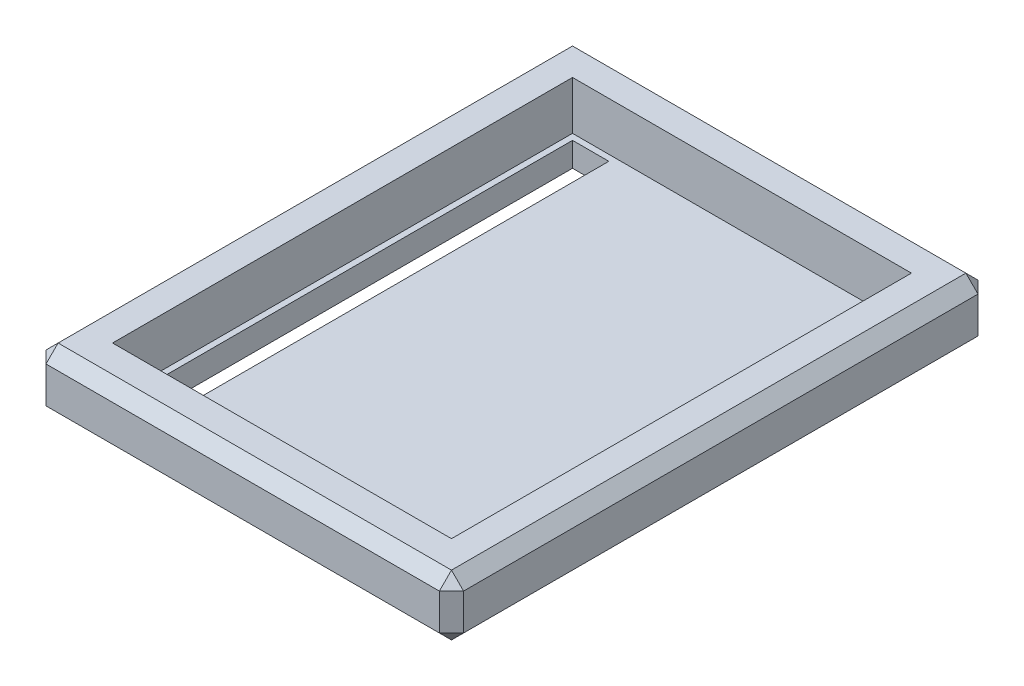
ISO-10303-21;
HEADER;
FILE_DESCRIPTION(('STEP AP214'),'2;1');
FILE_NAME('part.step','',(''),(''),'','','');
FILE_SCHEMA(('AUTOMOTIVE_DESIGN { 1 0 10303 214 1 1 1 1 }'));
ENDSEC;
DATA;
#1=APPLICATION_CONTEXT('core data for automotive mechanical design processes');
#2=APPLICATION_PROTOCOL_DEFINITION('international standard','automotive_design',2000,#1);
#3=PRODUCT_CONTEXT('',#1,'mechanical');
#4=PRODUCT('Part','Part','',(#3));
#5=PRODUCT_RELATED_PRODUCT_CATEGORY('part','',(#4));
#6=PRODUCT_DEFINITION_FORMATION('','',#4);
#7=PRODUCT_DEFINITION_CONTEXT('part definition',#1,'design');
#8=PRODUCT_DEFINITION('design','',#6,#7);
#9=PRODUCT_DEFINITION_SHAPE('','',#8);
#10=(LENGTH_UNIT() NAMED_UNIT(*) SI_UNIT(.MILLI.,.METRE.));
#11=(NAMED_UNIT(*) PLANE_ANGLE_UNIT() SI_UNIT($,.RADIAN.));
#12=(NAMED_UNIT(*) SI_UNIT($,.STERADIAN.) SOLID_ANGLE_UNIT());
#13=UNCERTAINTY_MEASURE_WITH_UNIT(LENGTH_MEASURE(1.E-05),#10,'distance_accuracy_value','');
#14=(GEOMETRIC_REPRESENTATION_CONTEXT(3) GLOBAL_UNCERTAINTY_ASSIGNED_CONTEXT((#13)) GLOBAL_UNIT_ASSIGNED_CONTEXT((#10,
#11,#12)) REPRESENTATION_CONTEXT('',''));
#15=CARTESIAN_POINT('',(0.,0.,0.));
#16=DIRECTION('',(0.,0.,1.));
#17=DIRECTION('',(1.,0.,0.));
#18=AXIS2_PLACEMENT_3D('',#15,#16,#17);
#19=CARTESIAN_POINT('',(-355.6,50.8,482.6));
#20=DIRECTION('',(1.,0.,0.));
#21=DIRECTION('',(0.,0.,-1.));
#22=AXIS2_PLACEMENT_3D('',#19,#20,#21);
#23=PLANE('',#22);
#24=DIRECTION('',(0.,0.,1.));
#25=VECTOR('',#24,1.);
#26=CARTESIAN_POINT('',(-355.6,25.4,-565.15));
#27=LINE('',#26,#25);
#28=CARTESIAN_POINT('',(-355.6,25.4,-482.6));
#29=VERTEX_POINT('',#28);
#30=CARTESIAN_POINT('',(-355.6,25.4,482.6));
#31=VERTEX_POINT('',#30);
#32=EDGE_CURVE('E293',#29,#31,#27,.T.);
#33=ORIENTED_EDGE('',*,*,#32,.F.);
#34=DIRECTION('',(0.,-1.,0.));
#35=VECTOR('',#34,1.);
#36=CARTESIAN_POINT('',(-355.6,50.8,-482.6));
#37=LINE('',#36,#35);
#38=CARTESIAN_POINT('',(-355.6,0.,-482.6));
#39=VERTEX_POINT('',#38);
#40=EDGE_CURVE('E287',#29,#39,#37,.T.);
#41=ORIENTED_EDGE('',*,*,#40,.T.);
#42=DIRECTION('',(0.,0.,1.));
#43=VECTOR('',#42,1.);
#44=CARTESIAN_POINT('',(-355.6,0.,482.6));
#45=LINE('',#44,#43);
#46=CARTESIAN_POINT('',(-355.6,0.,482.6));
#47=VERTEX_POINT('',#46);
#48=EDGE_CURVE('E280',#39,#47,#45,.T.);
#49=ORIENTED_EDGE('',*,*,#48,.T.);
#50=DIRECTION('',(0.,-1.,0.));
#51=VECTOR('',#50,1.);
#52=CARTESIAN_POINT('',(-355.6,50.8,482.6));
#53=LINE('',#52,#51);
#54=EDGE_CURVE('E265',#31,#47,#53,.T.);
#55=ORIENTED_EDGE('',*,*,#54,.F.);
#56=EDGE_LOOP('',(#33,#41,#49,#55));
#57=FACE_BOUND('',#56,.T.);
#58=ADVANCED_FACE('F33',(#57),#23,.F.);
#59=CARTESIAN_POINT('',(355.6,50.8,482.6));
#60=DIRECTION('',(-1.,0.,0.));
#61=DIRECTION('',(0.,0.,1.));
#62=AXIS2_PLACEMENT_3D('',#59,#60,#61);
#63=PLANE('',#62);
#64=DIRECTION('',(0.,0.,-1.));
#65=VECTOR('',#64,1.);
#66=CARTESIAN_POINT('',(355.6,25.4,565.15));
#67=LINE('',#66,#65);
#68=CARTESIAN_POINT('',(355.6,25.4,482.6));
#69=VERTEX_POINT('',#68);
#70=CARTESIAN_POINT('',(355.6,25.4,-482.6));
#71=VERTEX_POINT('',#70);
#72=EDGE_CURVE('E291',#69,#71,#67,.T.);
#73=ORIENTED_EDGE('',*,*,#72,.F.);
#74=DIRECTION('',(0.,-1.,0.));
#75=VECTOR('',#74,1.);
#76=CARTESIAN_POINT('',(355.6,50.8,482.6));
#77=LINE('',#76,#75);
#78=CARTESIAN_POINT('',(355.6,0.,482.6));
#79=VERTEX_POINT('',#78);
#80=EDGE_CURVE('E326',#69,#79,#77,.T.);
#81=ORIENTED_EDGE('',*,*,#80,.T.);
#82=DIRECTION('',(0.,0.,-1.));
#83=VECTOR('',#82,1.);
#84=CARTESIAN_POINT('',(355.6,0.,482.6));
#85=LINE('',#84,#83);
#86=CARTESIAN_POINT('',(355.6,0.,-482.6));
#87=VERTEX_POINT('',#86);
#88=EDGE_CURVE('E324',#79,#87,#85,.T.);
#89=ORIENTED_EDGE('',*,*,#88,.T.);
#90=DIRECTION('',(0.,-1.,0.));
#91=VECTOR('',#90,1.);
#92=CARTESIAN_POINT('',(355.6,50.8,-482.6));
#93=LINE('',#92,#91);
#94=EDGE_CURVE('E318',#71,#87,#93,.T.);
#95=ORIENTED_EDGE('',*,*,#94,.F.);
#96=EDGE_LOOP('',(#73,#81,#89,#95));
#97=FACE_BOUND('',#96,.T.);
#98=ADVANCED_FACE('F321',(#97),#63,.F.);
#99=CARTESIAN_POINT('',(-355.6,50.8,-482.6));
#100=DIRECTION('',(0.,0.,1.));
#101=DIRECTION('',(1.,0.,0.));
#102=AXIS2_PLACEMENT_3D('',#99,#100,#101);
#103=PLANE('',#102);
#104=DIRECTION('',(-1.,0.,0.));
#105=VECTOR('',#104,1.);
#106=CARTESIAN_POINT('',(355.6,25.4,-482.6));
#107=LINE('',#106,#105);
#108=EDGE_CURVE('E288',#71,#29,#107,.T.);
#109=ORIENTED_EDGE('',*,*,#108,.F.);
#110=ORIENTED_EDGE('',*,*,#94,.T.);
#111=DIRECTION('',(-1.,0.,0.));
#112=VECTOR('',#111,1.);
#113=CARTESIAN_POINT('',(-355.6,0.,-482.6));
#114=LINE('',#113,#112);
#115=EDGE_CURVE('E337',#87,#39,#114,.T.);
#116=ORIENTED_EDGE('',*,*,#115,.T.);
#117=ORIENTED_EDGE('',*,*,#40,.F.);
#118=EDGE_LOOP('',(#109,#110,#116,#117));
#119=FACE_BOUND('',#118,.T.);
#120=ADVANCED_FACE('F316',(#119),#103,.F.);
#121=CARTESIAN_POINT('',(-355.6,50.8,482.6));
#122=DIRECTION('',(0.,0.,-1.));
#123=DIRECTION('',(-1.,0.,0.));
#124=AXIS2_PLACEMENT_3D('',#121,#122,#123);
#125=PLANE('',#124);
#126=DIRECTION('',(1.,0.,0.));
#127=VECTOR('',#126,1.);
#128=CARTESIAN_POINT('',(-355.6,25.4,482.6));
#129=LINE('',#128,#127);
#130=EDGE_CURVE('E246',#31,#69,#129,.T.);
#131=ORIENTED_EDGE('',*,*,#130,.F.);
#132=ORIENTED_EDGE('',*,*,#54,.T.);
#133=DIRECTION('',(1.,0.,0.));
#134=VECTOR('',#133,1.);
#135=CARTESIAN_POINT('',(-355.6,0.,482.6));
#136=LINE('',#135,#134);
#137=EDGE_CURVE('E339',#47,#79,#136,.T.);
#138=ORIENTED_EDGE('',*,*,#137,.T.);
#139=ORIENTED_EDGE('',*,*,#80,.F.);
#140=EDGE_LOOP('',(#131,#132,#138,#139));
#141=FACE_BOUND('',#140,.T.);
#142=ADVANCED_FACE('F447',(#141),#125,.F.);
#143=CARTESIAN_POINT('',(-355.6,50.8,-482.6));
#144=DIRECTION('',(0.,-1.,0.));
#145=DIRECTION('',(0.,0.,-1.));
#146=AXIS2_PLACEMENT_3D('',#143,#144,#145);
#147=PLANE('',#146);
#148=DIRECTION('',(0.,0.,1.));
#149=VECTOR('',#148,1.);
#150=CARTESIAN_POINT('',(-342.9,50.8,-469.9));
#151=LINE('',#150,#149);
#152=CARTESIAN_POINT('',(-342.9,50.8,-469.9));
#153=VERTEX_POINT('',#152);
#154=CARTESIAN_POINT('',(-342.9,50.8,469.9));
#155=VERTEX_POINT('',#154);
#156=EDGE_CURVE('E365',#153,#155,#151,.T.);
#157=ORIENTED_EDGE('',*,*,#156,.F.);
#158=DIRECTION('',(-1.,0.,0.));
#159=VECTOR('',#158,1.);
#160=CARTESIAN_POINT('',(-342.9,50.8,-469.9));
#161=LINE('',#160,#159);
#162=CARTESIAN_POINT('',(-266.7,50.8,-469.9));
#163=VERTEX_POINT('',#162);
#164=EDGE_CURVE('E361',#163,#153,#161,.T.);
#165=ORIENTED_EDGE('',*,*,#164,.F.);
#166=DIRECTION('',(0.,0.,-1.));
#167=VECTOR('',#166,1.);
#168=CARTESIAN_POINT('',(-266.7,50.8,-469.9));
#169=LINE('',#168,#167);
#170=CARTESIAN_POINT('',(-266.7,50.8,469.9));
#171=VERTEX_POINT('',#170);
#172=EDGE_CURVE('E376',#171,#163,#169,.T.);
#173=ORIENTED_EDGE('',*,*,#172,.F.);
#174=DIRECTION('',(1.,0.,0.));
#175=VECTOR('',#174,1.);
#176=CARTESIAN_POINT('',(-342.9,50.8,469.9));
#177=LINE('',#176,#175);
#178=EDGE_CURVE('E379',#155,#171,#177,.T.);
#179=ORIENTED_EDGE('',*,*,#178,.F.);
#180=EDGE_LOOP('',(#157,#165,#173,#179));
#181=FACE_BOUND('',#180,.T.);
#182=DIRECTION('',(0.,0.,1.));
#183=VECTOR('',#182,1.);
#184=CARTESIAN_POINT('',(-355.6,50.8,482.6));
#185=LINE('',#184,#183);
#186=CARTESIAN_POINT('',(-355.6,50.8,-482.6));
#187=VERTEX_POINT('',#186);
#188=CARTESIAN_POINT('',(-355.6,50.8,482.6));
#189=VERTEX_POINT('',#188);
#190=EDGE_CURVE('E271',#187,#189,#185,.T.);
#191=ORIENTED_EDGE('',*,*,#190,.T.);
#192=DIRECTION('',(1.,0.,0.));
#193=VECTOR('',#192,1.);
#194=CARTESIAN_POINT('',(-355.6,50.8,482.6));
#195=LINE('',#194,#193);
#196=CARTESIAN_POINT('',(355.6,50.8,482.6));
#197=VERTEX_POINT('',#196);
#198=EDGE_CURVE('E245',#189,#197,#195,.T.);
#199=ORIENTED_EDGE('',*,*,#198,.T.);
#200=DIRECTION('',(0.,0.,-1.));
#201=VECTOR('',#200,1.);
#202=CARTESIAN_POINT('',(355.6,50.8,482.6));
#203=LINE('',#202,#201);
#204=CARTESIAN_POINT('',(355.6,50.8,-482.6));
#205=VERTEX_POINT('',#204);
#206=EDGE_CURVE('E270',#197,#205,#203,.T.);
#207=ORIENTED_EDGE('',*,*,#206,.T.);
#208=DIRECTION('',(-1.,0.,0.));
#209=VECTOR('',#208,1.);
#210=CARTESIAN_POINT('',(-355.6,50.8,-482.6));
#211=LINE('',#210,#209);
#212=EDGE_CURVE('E283',#205,#187,#211,.T.);
#213=ORIENTED_EDGE('',*,*,#212,.T.);
#214=EDGE_LOOP('',(#191,#199,#207,#213));
#215=FACE_BOUND('',#214,.T.);
#216=DIRECTION('',(0.,0.,-1.));
#217=VECTOR('',#216,1.);
#218=CARTESIAN_POINT('',(342.9,50.8,-469.9));
#219=LINE('',#218,#217);
#220=CARTESIAN_POINT('',(342.9,50.8,469.9));
#221=VERTEX_POINT('',#220);
#222=CARTESIAN_POINT('',(342.9,50.8,-469.9));
#223=VERTEX_POINT('',#222);
#224=EDGE_CURVE('E395',#221,#223,#219,.T.);
#225=ORIENTED_EDGE('',*,*,#224,.F.);
#226=DIRECTION('',(1.,0.,0.));
#227=VECTOR('',#226,1.);
#228=CARTESIAN_POINT('',(342.9,50.8,469.9));
#229=LINE('',#228,#227);
#230=CARTESIAN_POINT('',(266.7,50.8,469.9));
#231=VERTEX_POINT('',#230);
#232=EDGE_CURVE('E391',#231,#221,#229,.T.);
#233=ORIENTED_EDGE('',*,*,#232,.F.);
#234=DIRECTION('',(0.,0.,1.));
#235=VECTOR('',#234,1.);
#236=CARTESIAN_POINT('',(266.7,50.8,-469.9));
#237=LINE('',#236,#235);
#238=CARTESIAN_POINT('',(266.7,50.8,-469.9));
#239=VERTEX_POINT('',#238);
#240=EDGE_CURVE('E405',#239,#231,#237,.T.);
#241=ORIENTED_EDGE('',*,*,#240,.F.);
#242=DIRECTION('',(-1.,0.,0.));
#243=VECTOR('',#242,1.);
#244=CARTESIAN_POINT('',(342.9,50.8,-469.9));
#245=LINE('',#244,#243);
#246=EDGE_CURVE('E408',#223,#239,#245,.T.);
#247=ORIENTED_EDGE('',*,*,#246,.F.);
#248=EDGE_LOOP('',(#225,#233,#241,#247));
#249=FACE_BOUND('',#248,.T.);
#250=ADVANCED_FACE('F421',(#181,#215,#249),#147,.F.);
#251=CARTESIAN_POINT('',(-355.6,0.,-482.6));
#252=DIRECTION('',(0.,-1.,0.));
#253=DIRECTION('',(0.,0.,-1.));
#254=AXIS2_PLACEMENT_3D('',#251,#252,#253);
#255=PLANE('',#254);
#256=DIRECTION('',(-1.,0.,0.));
#257=VECTOR('',#256,1.);
#258=CARTESIAN_POINT('',(-342.9,0.,-469.9));
#259=LINE('',#258,#257);
#260=CARTESIAN_POINT('',(-266.7,0.,-469.9));
#261=VERTEX_POINT('',#260);
#262=CARTESIAN_POINT('',(-342.9,0.,-469.9));
#263=VERTEX_POINT('',#262);
#264=EDGE_CURVE('E362',#261,#263,#259,.T.);
#265=ORIENTED_EDGE('',*,*,#264,.T.);
#266=DIRECTION('',(0.,0.,1.));
#267=VECTOR('',#266,1.);
#268=CARTESIAN_POINT('',(-342.9,0.,-469.9));
#269=LINE('',#268,#267);
#270=CARTESIAN_POINT('',(-342.9,0.,469.9));
#271=VERTEX_POINT('',#270);
#272=EDGE_CURVE('E372',#263,#271,#269,.T.);
#273=ORIENTED_EDGE('',*,*,#272,.T.);
#274=DIRECTION('',(1.,0.,0.));
#275=VECTOR('',#274,1.);
#276=CARTESIAN_POINT('',(-342.9,0.,469.9));
#277=LINE('',#276,#275);
#278=CARTESIAN_POINT('',(-266.7,0.,469.9));
#279=VERTEX_POINT('',#278);
#280=EDGE_CURVE('E369',#271,#279,#277,.T.);
#281=ORIENTED_EDGE('',*,*,#280,.T.);
#282=DIRECTION('',(0.,0.,-1.));
#283=VECTOR('',#282,1.);
#284=CARTESIAN_POINT('',(-266.7,0.,-469.9));
#285=LINE('',#284,#283);
#286=EDGE_CURVE('E366',#279,#261,#285,.T.);
#287=ORIENTED_EDGE('',*,*,#286,.T.);
#288=EDGE_LOOP('',(#265,#273,#281,#287));
#289=FACE_BOUND('',#288,.T.);
#290=ORIENTED_EDGE('',*,*,#48,.F.);
#291=ORIENTED_EDGE('',*,*,#115,.F.);
#292=ORIENTED_EDGE('',*,*,#88,.F.);
#293=ORIENTED_EDGE('',*,*,#137,.F.);
#294=EDGE_LOOP('',(#290,#291,#292,#293));
#295=FACE_BOUND('',#294,.T.);
#296=DIRECTION('',(1.,0.,0.));
#297=VECTOR('',#296,1.);
#298=CARTESIAN_POINT('',(342.9,0.,469.9));
#299=LINE('',#298,#297);
#300=CARTESIAN_POINT('',(266.7,0.,469.9));
#301=VERTEX_POINT('',#300);
#302=CARTESIAN_POINT('',(342.9,0.,469.9));
#303=VERTEX_POINT('',#302);
#304=EDGE_CURVE('E392',#301,#303,#299,.T.);
#305=ORIENTED_EDGE('',*,*,#304,.T.);
#306=DIRECTION('',(0.,0.,-1.));
#307=VECTOR('',#306,1.);
#308=CARTESIAN_POINT('',(342.9,0.,-469.9));
#309=LINE('',#308,#307);
#310=CARTESIAN_POINT('',(342.9,0.,-469.9));
#311=VERTEX_POINT('',#310);
#312=EDGE_CURVE('E239',#303,#311,#309,.T.);
#313=ORIENTED_EDGE('',*,*,#312,.T.);
#314=DIRECTION('',(-1.,0.,0.));
#315=VECTOR('',#314,1.);
#316=CARTESIAN_POINT('',(342.9,0.,-469.9));
#317=LINE('',#316,#315);
#318=CARTESIAN_POINT('',(266.7,0.,-469.9));
#319=VERTEX_POINT('',#318);
#320=EDGE_CURVE('E399',#311,#319,#317,.T.);
#321=ORIENTED_EDGE('',*,*,#320,.T.);
#322=DIRECTION('',(0.,0.,1.));
#323=VECTOR('',#322,1.);
#324=CARTESIAN_POINT('',(266.7,0.,-469.9));
#325=LINE('',#324,#323);
#326=EDGE_CURVE('E396',#319,#301,#325,.T.);
#327=ORIENTED_EDGE('',*,*,#326,.T.);
#328=EDGE_LOOP('',(#305,#313,#321,#327));
#329=FACE_BOUND('',#328,.T.);
#330=ADVANCED_FACE('F427',(#289,#295,#329),#255,.T.);
#331=CARTESIAN_POINT('',(-342.9,50.8,-469.9));
#332=DIRECTION('',(1.,0.,0.));
#333=DIRECTION('',(0.,0.,-1.));
#334=AXIS2_PLACEMENT_3D('',#331,#332,#333);
#335=PLANE('',#334);
#336=ORIENTED_EDGE('',*,*,#272,.F.);
#337=DIRECTION('',(0.,-1.,0.));
#338=VECTOR('',#337,1.);
#339=CARTESIAN_POINT('',(-342.9,50.8,-469.9));
#340=LINE('',#339,#338);
#341=EDGE_CURVE('E356',#153,#263,#340,.T.);
#342=ORIENTED_EDGE('',*,*,#341,.F.);
#343=ORIENTED_EDGE('',*,*,#156,.T.);
#344=DIRECTION('',(0.,-1.,0.));
#345=VECTOR('',#344,1.);
#346=CARTESIAN_POINT('',(-342.9,50.8,469.9));
#347=LINE('',#346,#345);
#348=EDGE_CURVE('E276',#155,#271,#347,.T.);
#349=ORIENTED_EDGE('',*,*,#348,.T.);
#350=EDGE_LOOP('',(#336,#342,#343,#349));
#351=FACE_BOUND('',#350,.T.);
#352=ADVANCED_FACE('F1023',(#351),#335,.T.);
#353=CARTESIAN_POINT('',(-342.9,50.8,469.9));
#354=DIRECTION('',(0.,0.,-1.));
#355=DIRECTION('',(-1.,0.,0.));
#356=AXIS2_PLACEMENT_3D('',#353,#354,#355);
#357=PLANE('',#356);
#358=ORIENTED_EDGE('',*,*,#280,.F.);
#359=ORIENTED_EDGE('',*,*,#348,.F.);
#360=ORIENTED_EDGE('',*,*,#178,.T.);
#361=DIRECTION('',(0.,-1.,0.));
#362=VECTOR('',#361,1.);
#363=CARTESIAN_POINT('',(-266.7,50.8,469.9));
#364=LINE('',#363,#362);
#365=EDGE_CURVE('E348',#171,#279,#364,.T.);
#366=ORIENTED_EDGE('',*,*,#365,.T.);
#367=EDGE_LOOP('',(#358,#359,#360,#366));
#368=FACE_BOUND('',#367,.T.);
#369=ADVANCED_FACE('F1013',(#368),#357,.T.);
#370=CARTESIAN_POINT('',(-266.7,50.8,-469.9));
#371=DIRECTION('',(-1.,0.,0.));
#372=DIRECTION('',(0.,0.,1.));
#373=AXIS2_PLACEMENT_3D('',#370,#371,#372);
#374=PLANE('',#373);
#375=ORIENTED_EDGE('',*,*,#286,.F.);
#376=ORIENTED_EDGE('',*,*,#365,.F.);
#377=ORIENTED_EDGE('',*,*,#172,.T.);
#378=DIRECTION('',(0.,-1.,0.));
#379=VECTOR('',#378,1.);
#380=CARTESIAN_POINT('',(-266.7,50.8,-469.9));
#381=LINE('',#380,#379);
#382=EDGE_CURVE('E352',#163,#261,#381,.T.);
#383=ORIENTED_EDGE('',*,*,#382,.T.);
#384=EDGE_LOOP('',(#375,#376,#377,#383));
#385=FACE_BOUND('',#384,.T.);
#386=ADVANCED_FACE('F1003',(#385),#374,.T.);
#387=CARTESIAN_POINT('',(-342.9,50.8,-469.9));
#388=DIRECTION('',(0.,0.,1.));
#389=DIRECTION('',(1.,0.,0.));
#390=AXIS2_PLACEMENT_3D('',#387,#388,#389);
#391=PLANE('',#390);
#392=ORIENTED_EDGE('',*,*,#264,.F.);
#393=ORIENTED_EDGE('',*,*,#382,.F.);
#394=ORIENTED_EDGE('',*,*,#164,.T.);
#395=ORIENTED_EDGE('',*,*,#341,.T.);
#396=EDGE_LOOP('',(#392,#393,#394,#395));
#397=FACE_BOUND('',#396,.T.);
#398=ADVANCED_FACE('F994',(#397),#391,.T.);
#399=CARTESIAN_POINT('',(342.9,50.8,-469.9));
#400=DIRECTION('',(-1.,0.,0.));
#401=DIRECTION('',(0.,0.,1.));
#402=AXIS2_PLACEMENT_3D('',#399,#400,#401);
#403=PLANE('',#402);
#404=ORIENTED_EDGE('',*,*,#312,.F.);
#405=DIRECTION('',(0.,-1.,0.));
#406=VECTOR('',#405,1.);
#407=CARTESIAN_POINT('',(342.9,50.8,469.9));
#408=LINE('',#407,#406);
#409=EDGE_CURVE('E388',#221,#303,#408,.T.);
#410=ORIENTED_EDGE('',*,*,#409,.F.);
#411=ORIENTED_EDGE('',*,*,#224,.T.);
#412=DIRECTION('',(0.,-1.,0.));
#413=VECTOR('',#412,1.);
#414=CARTESIAN_POINT('',(342.9,50.8,-469.9));
#415=LINE('',#414,#413);
#416=EDGE_CURVE('E374',#223,#311,#415,.T.);
#417=ORIENTED_EDGE('',*,*,#416,.T.);
#418=EDGE_LOOP('',(#404,#410,#411,#417));
#419=FACE_BOUND('',#418,.T.);
#420=ADVANCED_FACE('F413',(#419),#403,.T.);
#421=CARTESIAN_POINT('',(342.9,50.8,-469.9));
#422=DIRECTION('',(0.,0.,1.));
#423=DIRECTION('',(1.,0.,0.));
#424=AXIS2_PLACEMENT_3D('',#421,#422,#423);
#425=PLANE('',#424);
#426=ORIENTED_EDGE('',*,*,#320,.F.);
#427=ORIENTED_EDGE('',*,*,#416,.F.);
#428=ORIENTED_EDGE('',*,*,#246,.T.);
#429=DIRECTION('',(0.,-1.,0.));
#430=VECTOR('',#429,1.);
#431=CARTESIAN_POINT('',(266.7,50.8,-469.9));
#432=LINE('',#431,#430);
#433=EDGE_CURVE('E384',#239,#319,#432,.T.);
#434=ORIENTED_EDGE('',*,*,#433,.T.);
#435=EDGE_LOOP('',(#426,#427,#428,#434));
#436=FACE_BOUND('',#435,.T.);
#437=ADVANCED_FACE('F418',(#436),#425,.T.);
#438=CARTESIAN_POINT('',(266.7,50.8,-469.9));
#439=DIRECTION('',(1.,0.,0.));
#440=DIRECTION('',(0.,0.,-1.));
#441=AXIS2_PLACEMENT_3D('',#438,#439,#440);
#442=PLANE('',#441);
#443=ORIENTED_EDGE('',*,*,#326,.F.);
#444=ORIENTED_EDGE('',*,*,#433,.F.);
#445=ORIENTED_EDGE('',*,*,#240,.T.);
#446=DIRECTION('',(0.,-1.,0.));
#447=VECTOR('',#446,1.);
#448=CARTESIAN_POINT('',(266.7,50.8,469.9));
#449=LINE('',#448,#447);
#450=EDGE_CURVE('E386',#231,#301,#449,.T.);
#451=ORIENTED_EDGE('',*,*,#450,.T.);
#452=EDGE_LOOP('',(#443,#444,#445,#451));
#453=FACE_BOUND('',#452,.T.);
#454=ADVANCED_FACE('F424',(#453),#442,.T.);
#455=CARTESIAN_POINT('',(342.9,50.8,469.9));
#456=DIRECTION('',(0.,0.,-1.));
#457=DIRECTION('',(-1.,0.,0.));
#458=AXIS2_PLACEMENT_3D('',#455,#456,#457);
#459=PLANE('',#458);
#460=ORIENTED_EDGE('',*,*,#304,.F.);
#461=ORIENTED_EDGE('',*,*,#450,.F.);
#462=ORIENTED_EDGE('',*,*,#232,.T.);
#463=ORIENTED_EDGE('',*,*,#409,.T.);
#464=EDGE_LOOP('',(#460,#461,#462,#463));
#465=FACE_BOUND('',#464,.T.);
#466=ADVANCED_FACE('F429',(#465),#459,.T.);
#467=CARTESIAN_POINT('',(-355.6,152.4,482.6));
#468=DIRECTION('',(0.,0.,-1.));
#469=DIRECTION('',(-1.,0.,0.));
#470=AXIS2_PLACEMENT_3D('',#467,#468,#469);
#471=PLANE('',#470);
#472=ORIENTED_EDGE('',*,*,#198,.F.);
#473=DIRECTION('',(0.,-1.,0.));
#474=VECTOR('',#473,1.);
#475=CARTESIAN_POINT('',(-355.6,25.4,482.6));
#476=LINE('',#475,#474);
#477=CARTESIAN_POINT('',(-355.6,152.4,482.6));
#478=VERTEX_POINT('',#477);
#479=EDGE_CURVE('E224',#478,#189,#476,.T.);
#480=ORIENTED_EDGE('',*,*,#479,.F.);
#481=DIRECTION('',(-1.,0.,0.));
#482=VECTOR('',#481,1.);
#483=CARTESIAN_POINT('',(-355.6,152.4,482.6));
#484=LINE('',#483,#482);
#485=CARTESIAN_POINT('',(355.6,152.4,482.6));
#486=VERTEX_POINT('',#485);
#487=EDGE_CURVE('E235',#486,#478,#484,.T.);
#488=ORIENTED_EDGE('',*,*,#487,.F.);
#489=DIRECTION('',(0.,1.,0.));
#490=VECTOR('',#489,1.);
#491=CARTESIAN_POINT('',(355.6,25.4,482.6));
#492=LINE('',#491,#490);
#493=EDGE_CURVE('E240',#197,#486,#492,.T.);
#494=ORIENTED_EDGE('',*,*,#493,.F.);
#495=EDGE_LOOP('',(#472,#480,#488,#494));
#496=FACE_BOUND('',#495,.T.);
#497=ADVANCED_FACE('F243',(#496),#471,.T.);
#498=CARTESIAN_POINT('',(-355.6,25.4,565.15));
#499=DIRECTION('',(0.,1.,0.));
#500=DIRECTION('',(0.,0.,1.));
#501=AXIS2_PLACEMENT_3D('',#498,#499,#500);
#502=PLANE('',#501);
#503=DIRECTION('',(0.,0.,1.));
#504=VECTOR('',#503,1.);
#505=CARTESIAN_POINT('',(412.75,25.4,565.15));
#506=LINE('',#505,#504);
#507=CARTESIAN_POINT('',(412.75,25.4,-539.75));
#508=VERTEX_POINT('',#507);
#509=CARTESIAN_POINT('',(412.75,25.4,539.75));
#510=VERTEX_POINT('',#509);
#511=EDGE_CURVE('E668',#508,#510,#506,.T.);
#512=ORIENTED_EDGE('',*,*,#511,.T.);
#513=DIRECTION('',(-1.,0.,0.));
#514=VECTOR('',#513,1.);
#515=CARTESIAN_POINT('',(-355.6,25.4,539.75));
#516=LINE('',#515,#514);
#517=CARTESIAN_POINT('',(-412.75,25.4,539.75));
#518=VERTEX_POINT('',#517);
#519=EDGE_CURVE('E550',#510,#518,#516,.T.);
#520=ORIENTED_EDGE('',*,*,#519,.T.);
#521=DIRECTION('',(0.,0.,-1.));
#522=VECTOR('',#521,1.);
#523=CARTESIAN_POINT('',(-412.75,25.4,565.15));
#524=LINE('',#523,#522);
#525=CARTESIAN_POINT('',(-412.75,25.4,-539.75));
#526=VERTEX_POINT('',#525);
#527=EDGE_CURVE('E675',#518,#526,#524,.T.);
#528=ORIENTED_EDGE('',*,*,#527,.T.);
#529=DIRECTION('',(1.,0.,0.));
#530=VECTOR('',#529,1.);
#531=CARTESIAN_POINT('',(-355.6,25.4,-539.75));
#532=LINE('',#531,#530);
#533=EDGE_CURVE('E652',#526,#508,#532,.T.);
#534=ORIENTED_EDGE('',*,*,#533,.T.);
#535=EDGE_LOOP('',(#512,#520,#528,#534));
#536=FACE_BOUND('',#535,.T.);
#537=ORIENTED_EDGE('',*,*,#108,.T.);
#538=ORIENTED_EDGE('',*,*,#32,.T.);
#539=ORIENTED_EDGE('',*,*,#130,.T.);
#540=ORIENTED_EDGE('',*,*,#72,.T.);
#541=EDGE_LOOP('',(#537,#538,#539,#540));
#542=FACE_BOUND('',#541,.T.);
#543=ADVANCED_FACE('F311',(#536,#542),#502,.F.);
#544=CARTESIAN_POINT('',(-355.6,152.4,565.15));
#545=DIRECTION('',(0.,-1.,0.));
#546=DIRECTION('',(0.,0.,-1.));
#547=AXIS2_PLACEMENT_3D('',#544,#545,#546);
#548=PLANE('',#547);
#549=DIRECTION('',(0.,0.,1.));
#550=VECTOR('',#549,1.);
#551=CARTESIAN_POINT('',(-412.75,152.4,565.15));
#552=LINE('',#551,#550);
#553=CARTESIAN_POINT('',(-412.75,152.4,-539.75));
#554=VERTEX_POINT('',#553);
#555=CARTESIAN_POINT('',(-412.75,152.4,539.75));
#556=VERTEX_POINT('',#555);
#557=EDGE_CURVE('E538',#554,#556,#552,.T.);
#558=ORIENTED_EDGE('',*,*,#557,.T.);
#559=DIRECTION('',(1.,0.,0.));
#560=VECTOR('',#559,1.);
#561=CARTESIAN_POINT('',(-355.6,152.4,539.75));
#562=LINE('',#561,#560);
#563=CARTESIAN_POINT('',(412.75,152.4,539.75));
#564=VERTEX_POINT('',#563);
#565=EDGE_CURVE('E548',#556,#564,#562,.T.);
#566=ORIENTED_EDGE('',*,*,#565,.T.);
#567=DIRECTION('',(0.,0.,-1.));
#568=VECTOR('',#567,1.);
#569=CARTESIAN_POINT('',(412.75,152.4,565.15));
#570=LINE('',#569,#568);
#571=CARTESIAN_POINT('',(412.75,152.4,-539.75));
#572=VERTEX_POINT('',#571);
#573=EDGE_CURVE('E545',#564,#572,#570,.T.);
#574=ORIENTED_EDGE('',*,*,#573,.T.);
#575=DIRECTION('',(-1.,0.,0.));
#576=VECTOR('',#575,1.);
#577=CARTESIAN_POINT('',(-355.6,152.4,-539.75));
#578=LINE('',#577,#576);
#579=EDGE_CURVE('E546',#572,#554,#578,.T.);
#580=ORIENTED_EDGE('',*,*,#579,.T.);
#581=EDGE_LOOP('',(#558,#566,#574,#580));
#582=FACE_BOUND('',#581,.T.);
#583=ORIENTED_EDGE('',*,*,#487,.T.);
#584=DIRECTION('',(0.,0.,-1.));
#585=VECTOR('',#584,1.);
#586=CARTESIAN_POINT('',(-355.6,152.4,-565.15));
#587=LINE('',#586,#585);
#588=CARTESIAN_POINT('',(-355.6,152.4,-482.6));
#589=VERTEX_POINT('',#588);
#590=EDGE_CURVE('E220',#478,#589,#587,.T.);
#591=ORIENTED_EDGE('',*,*,#590,.T.);
#592=DIRECTION('',(1.,0.,0.));
#593=VECTOR('',#592,1.);
#594=CARTESIAN_POINT('',(355.6,152.4,-482.6));
#595=LINE('',#594,#593);
#596=CARTESIAN_POINT('',(355.6,152.4,-482.6));
#597=VERTEX_POINT('',#596);
#598=EDGE_CURVE('E247',#589,#597,#595,.T.);
#599=ORIENTED_EDGE('',*,*,#598,.T.);
#600=DIRECTION('',(0.,0.,1.));
#601=VECTOR('',#600,1.);
#602=CARTESIAN_POINT('',(355.6,152.4,565.15));
#603=LINE('',#602,#601);
#604=EDGE_CURVE('E231',#597,#486,#603,.T.);
#605=ORIENTED_EDGE('',*,*,#604,.T.);
#606=EDGE_LOOP('',(#583,#591,#599,#605));
#607=FACE_BOUND('',#606,.T.);
#608=ADVANCED_FACE('F236',(#582,#607),#548,.F.);
#609=CARTESIAN_POINT('',(-355.6,152.4,565.15));
#610=DIRECTION('',(0.,0.,-1.));
#611=DIRECTION('',(-1.,0.,0.));
#612=AXIS2_PLACEMENT_3D('',#609,#610,#611);
#613=PLANE('',#612);
#614=DIRECTION('',(1.,0.,0.));
#615=VECTOR('',#614,1.);
#616=CARTESIAN_POINT('',(-355.6,50.8000000000003,565.15));
#617=LINE('',#616,#615);
#618=CARTESIAN_POINT('',(-412.75,50.8000000000003,565.15));
#619=VERTEX_POINT('',#618);
#620=CARTESIAN_POINT('',(412.75,50.8000000000003,565.15));
#621=VERTEX_POINT('',#620);
#622=EDGE_CURVE('E678',#619,#621,#617,.T.);
#623=ORIENTED_EDGE('',*,*,#622,.T.);
#624=DIRECTION('',(0.,1.,0.));
#625=VECTOR('',#624,1.);
#626=CARTESIAN_POINT('',(412.75,152.4,565.15));
#627=LINE('',#626,#625);
#628=CARTESIAN_POINT('',(412.75,127.,565.15));
#629=VERTEX_POINT('',#628);
#630=EDGE_CURVE('E662',#621,#629,#627,.T.);
#631=ORIENTED_EDGE('',*,*,#630,.T.);
#632=DIRECTION('',(-1.,0.,0.));
#633=VECTOR('',#632,1.);
#634=CARTESIAN_POINT('',(-355.6,127.,565.15));
#635=LINE('',#634,#633);
#636=CARTESIAN_POINT('',(-412.75,127.,565.15));
#637=VERTEX_POINT('',#636);
#638=EDGE_CURVE('E659',#629,#637,#635,.T.);
#639=ORIENTED_EDGE('',*,*,#638,.T.);
#640=DIRECTION('',(0.,-1.,0.));
#641=VECTOR('',#640,1.);
#642=CARTESIAN_POINT('',(-412.75,152.4,565.15));
#643=LINE('',#642,#641);
#644=EDGE_CURVE('E681',#637,#619,#643,.T.);
#645=ORIENTED_EDGE('',*,*,#644,.T.);
#646=EDGE_LOOP('',(#623,#631,#639,#645));
#647=FACE_BOUND('',#646,.T.);
#648=ADVANCED_FACE('F691',(#647),#613,.F.);
#649=CARTESIAN_POINT('',(355.6,152.4,-482.6));
#650=DIRECTION('',(0.,0.,1.));
#651=DIRECTION('',(1.,0.,0.));
#652=AXIS2_PLACEMENT_3D('',#649,#650,#651);
#653=PLANE('',#652);
#654=ORIENTED_EDGE('',*,*,#212,.F.);
#655=DIRECTION('',(0.,-1.,0.));
#656=VECTOR('',#655,1.);
#657=CARTESIAN_POINT('',(355.6,25.4,-482.6));
#658=LINE('',#657,#656);
#659=EDGE_CURVE('E301',#597,#205,#658,.T.);
#660=ORIENTED_EDGE('',*,*,#659,.F.);
#661=ORIENTED_EDGE('',*,*,#598,.F.);
#662=DIRECTION('',(0.,1.,0.));
#663=VECTOR('',#662,1.);
#664=CARTESIAN_POINT('',(-355.6,25.4,-482.6));
#665=LINE('',#664,#663);
#666=EDGE_CURVE('E227',#187,#589,#665,.T.);
#667=ORIENTED_EDGE('',*,*,#666,.F.);
#668=EDGE_LOOP('',(#654,#660,#661,#667));
#669=FACE_BOUND('',#668,.T.);
#670=ADVANCED_FACE('F702',(#669),#653,.T.);
#671=CARTESIAN_POINT('',(355.6,152.4,-565.15));
#672=DIRECTION('',(0.,0.,1.));
#673=DIRECTION('',(1.,0.,0.));
#674=AXIS2_PLACEMENT_3D('',#671,#672,#673);
#675=PLANE('',#674);
#676=DIRECTION('',(0.,-1.,0.));
#677=VECTOR('',#676,1.);
#678=CARTESIAN_POINT('',(412.75,152.4,-565.15));
#679=LINE('',#678,#677);
#680=CARTESIAN_POINT('',(412.75,127.,-565.15));
#681=VERTEX_POINT('',#680);
#682=CARTESIAN_POINT('',(412.75,50.8000000000003,-565.15));
#683=VERTEX_POINT('',#682);
#684=EDGE_CURVE('E564',#681,#683,#679,.T.);
#685=ORIENTED_EDGE('',*,*,#684,.T.);
#686=DIRECTION('',(-1.,0.,0.));
#687=VECTOR('',#686,1.);
#688=CARTESIAN_POINT('',(355.6,50.8000000000003,-565.15));
#689=LINE('',#688,#687);
#690=CARTESIAN_POINT('',(-412.75,50.8000000000003,-565.15));
#691=VERTEX_POINT('',#690);
#692=EDGE_CURVE('E570',#683,#691,#689,.T.);
#693=ORIENTED_EDGE('',*,*,#692,.T.);
#694=DIRECTION('',(0.,1.,0.));
#695=VECTOR('',#694,1.);
#696=CARTESIAN_POINT('',(-412.75,152.4,-565.15));
#697=LINE('',#696,#695);
#698=CARTESIAN_POINT('',(-412.75,127.,-565.15));
#699=VERTEX_POINT('',#698);
#700=EDGE_CURVE('E568',#691,#699,#697,.T.);
#701=ORIENTED_EDGE('',*,*,#700,.T.);
#702=DIRECTION('',(1.,0.,0.));
#703=VECTOR('',#702,1.);
#704=CARTESIAN_POINT('',(355.6,127.,-565.15));
#705=LINE('',#704,#703);
#706=EDGE_CURVE('E566',#699,#681,#705,.T.);
#707=ORIENTED_EDGE('',*,*,#706,.T.);
#708=EDGE_LOOP('',(#685,#693,#701,#707));
#709=FACE_BOUND('',#708,.T.);
#710=ADVANCED_FACE('F646',(#709),#675,.F.);
#711=CARTESIAN_POINT('',(438.15,152.4,565.15));
#712=DIRECTION('',(-1.,0.,0.));
#713=DIRECTION('',(0.,0.,1.));
#714=AXIS2_PLACEMENT_3D('',#711,#712,#713);
#715=PLANE('',#714);
#716=DIRECTION('',(0.,-1.,0.));
#717=VECTOR('',#716,1.);
#718=CARTESIAN_POINT('',(438.15,152.4,539.75));
#719=LINE('',#718,#717);
#720=CARTESIAN_POINT('',(438.15,127.,539.75));
#721=VERTEX_POINT('',#720);
#722=CARTESIAN_POINT('',(438.15,50.8000000000003,539.75));
#723=VERTEX_POINT('',#722);
#724=EDGE_CURVE('E559',#721,#723,#719,.T.);
#725=ORIENTED_EDGE('',*,*,#724,.T.);
#726=DIRECTION('',(0.,0.,-1.));
#727=VECTOR('',#726,1.);
#728=CARTESIAN_POINT('',(438.15,50.8000000000003,565.15));
#729=LINE('',#728,#727);
#730=CARTESIAN_POINT('',(438.15,50.8000000000003,-539.75));
#731=VERTEX_POINT('',#730);
#732=EDGE_CURVE('E561',#723,#731,#729,.T.);
#733=ORIENTED_EDGE('',*,*,#732,.T.);
#734=DIRECTION('',(0.,1.,0.));
#735=VECTOR('',#734,1.);
#736=CARTESIAN_POINT('',(438.15,152.4,-539.75));
#737=LINE('',#736,#735);
#738=CARTESIAN_POINT('',(438.15,127.,-539.75));
#739=VERTEX_POINT('',#738);
#740=EDGE_CURVE('E555',#731,#739,#737,.T.);
#741=ORIENTED_EDGE('',*,*,#740,.T.);
#742=DIRECTION('',(0.,0.,1.));
#743=VECTOR('',#742,1.);
#744=CARTESIAN_POINT('',(438.15,127.,565.15));
#745=LINE('',#744,#743);
#746=EDGE_CURVE('E557',#739,#721,#745,.T.);
#747=ORIENTED_EDGE('',*,*,#746,.T.);
#748=EDGE_LOOP('',(#725,#733,#741,#747));
#749=FACE_BOUND('',#748,.T.);
#750=ADVANCED_FACE('F639',(#749),#715,.F.);
#751=CARTESIAN_POINT('',(355.6,152.4,565.15));
#752=DIRECTION('',(-1.,0.,0.));
#753=DIRECTION('',(0.,0.,1.));
#754=AXIS2_PLACEMENT_3D('',#751,#752,#753);
#755=PLANE('',#754);
#756=ORIENTED_EDGE('',*,*,#604,.F.);
#757=ORIENTED_EDGE('',*,*,#659,.T.);
#758=ORIENTED_EDGE('',*,*,#206,.F.);
#759=ORIENTED_EDGE('',*,*,#493,.T.);
#760=EDGE_LOOP('',(#756,#757,#758,#759));
#761=FACE_BOUND('',#760,.T.);
#762=ADVANCED_FACE('F708',(#761),#755,.T.);
#763=CARTESIAN_POINT('',(-438.15,152.4,-565.15));
#764=DIRECTION('',(1.,0.,0.));
#765=DIRECTION('',(0.,0.,-1.));
#766=AXIS2_PLACEMENT_3D('',#763,#764,#765);
#767=PLANE('',#766);
#768=DIRECTION('',(0.,-1.,0.));
#769=VECTOR('',#768,1.);
#770=CARTESIAN_POINT('',(-438.15,152.4,-539.75));
#771=LINE('',#770,#769);
#772=CARTESIAN_POINT('',(-438.15,127.,-539.75));
#773=VERTEX_POINT('',#772);
#774=CARTESIAN_POINT('',(-438.15,50.8000000000003,-539.75));
#775=VERTEX_POINT('',#774);
#776=EDGE_CURVE('E573',#773,#775,#771,.T.);
#777=ORIENTED_EDGE('',*,*,#776,.T.);
#778=DIRECTION('',(0.,0.,1.));
#779=VECTOR('',#778,1.);
#780=CARTESIAN_POINT('',(-438.15,50.8000000000003,-565.15));
#781=LINE('',#780,#779);
#782=CARTESIAN_POINT('',(-438.15,50.8000000000003,539.75));
#783=VERTEX_POINT('',#782);
#784=EDGE_CURVE('E11',#775,#783,#781,.T.);
#785=ORIENTED_EDGE('',*,*,#784,.T.);
#786=DIRECTION('',(0.,1.,0.));
#787=VECTOR('',#786,1.);
#788=CARTESIAN_POINT('',(-438.15,152.4,539.75));
#789=LINE('',#788,#787);
#790=CARTESIAN_POINT('',(-438.15,127.,539.75));
#791=VERTEX_POINT('',#790);
#792=EDGE_CURVE('E42',#783,#791,#789,.T.);
#793=ORIENTED_EDGE('',*,*,#792,.T.);
#794=DIRECTION('',(0.,0.,-1.));
#795=VECTOR('',#794,1.);
#796=CARTESIAN_POINT('',(-438.15,127.,-565.15));
#797=LINE('',#796,#795);
#798=EDGE_CURVE('E575',#791,#773,#797,.T.);
#799=ORIENTED_EDGE('',*,*,#798,.T.);
#800=EDGE_LOOP('',(#777,#785,#793,#799));
#801=FACE_BOUND('',#800,.T.);
#802=ADVANCED_FACE('F711',(#801),#767,.F.);
#803=CARTESIAN_POINT('',(-355.6,152.4,-565.15));
#804=DIRECTION('',(1.,0.,0.));
#805=DIRECTION('',(0.,0.,-1.));
#806=AXIS2_PLACEMENT_3D('',#803,#804,#805);
#807=PLANE('',#806);
#808=ORIENTED_EDGE('',*,*,#590,.F.);
#809=ORIENTED_EDGE('',*,*,#479,.T.);
#810=ORIENTED_EDGE('',*,*,#190,.F.);
#811=ORIENTED_EDGE('',*,*,#666,.T.);
#812=EDGE_LOOP('',(#808,#809,#810,#811));
#813=FACE_BOUND('',#812,.T.);
#814=ADVANCED_FACE('F222',(#813),#807,.T.);
#815=CARTESIAN_POINT('',(355.6,127.,-565.15));
#816=DIRECTION('',(0.,-0.707106781186548,0.707106781186548));
#817=DIRECTION('',(0.,-0.707106781186548,-0.707106781186548));
#818=AXIS2_PLACEMENT_3D('',#815,#816,#817);
#819=PLANE('',#818);
#820=DIRECTION('',(0.,0.707106781186548,0.707106781186548));
#821=VECTOR('',#820,1.);
#822=CARTESIAN_POINT('',(-412.75,139.7,-552.45));
#823=LINE('',#822,#821);
#824=EDGE_CURVE('E37',#554,#699,#823,.F.);
#825=ORIENTED_EDGE('',*,*,#824,.F.);
#826=ORIENTED_EDGE('',*,*,#579,.F.);
#827=DIRECTION('',(0.,-0.707106781186548,-0.707106781186548));
#828=VECTOR('',#827,1.);
#829=CARTESIAN_POINT('',(412.75,152.4,-539.75));
#830=LINE('',#829,#828);
#831=EDGE_CURVE('E626',#681,#572,#830,.F.);
#832=ORIENTED_EDGE('',*,*,#831,.F.);
#833=ORIENTED_EDGE('',*,*,#706,.F.);
#834=EDGE_LOOP('',(#825,#826,#832,#833));
#835=FACE_BOUND('',#834,.T.);
#836=ADVANCED_FACE('F35',(#835),#819,.F.);
#837=CARTESIAN_POINT('',(-438.15,127.,-539.75));
#838=DIRECTION('',(-0.577350269189626,0.577350269189626,-0.577350269189626));
#839=DIRECTION('',(-0.707106781186547,0.,0.707106781186547));
#840=AXIS2_PLACEMENT_3D('',#837,#838,#839);
#841=PLANE('',#840);
#842=DIRECTION('',(-0.707106781186548,-0.707106781186548,0.));
#843=VECTOR('',#842,1.);
#844=CARTESIAN_POINT('',(-438.15,127.,-539.75));
#845=LINE('',#844,#843);
#846=EDGE_CURVE('E529',#554,#773,#845,.T.);
#847=ORIENTED_EDGE('',*,*,#846,.F.);
#848=ORIENTED_EDGE('',*,*,#824,.T.);
#849=DIRECTION('',(0.707106781186548,0.,-0.707106781186548));
#850=VECTOR('',#849,1.);
#851=CARTESIAN_POINT('',(-438.15,127.,-539.75));
#852=LINE('',#851,#850);
#853=EDGE_CURVE('E533',#773,#699,#852,.T.);
#854=ORIENTED_EDGE('',*,*,#853,.F.);
#855=EDGE_LOOP('',(#847,#848,#854));
#856=FACE_BOUND('',#855,.T.);
#857=ADVANCED_FACE('F517',(#856),#841,.T.);
#858=CARTESIAN_POINT('',(412.75,152.4,-539.75));
#859=DIRECTION('',(0.577350269189626,0.577350269189626,-0.577350269189626));
#860=DIRECTION('',(-0.707106781186547,0.,-0.707106781186547));
#861=AXIS2_PLACEMENT_3D('',#858,#859,#860);
#862=PLANE('',#861);
#863=DIRECTION('',(0.707106781186548,0.,0.707106781186548));
#864=VECTOR('',#863,1.);
#865=CARTESIAN_POINT('',(425.45,127.,-552.45));
#866=LINE('',#865,#864);
#867=EDGE_CURVE('E621',#681,#739,#866,.T.);
#868=ORIENTED_EDGE('',*,*,#867,.F.);
#869=ORIENTED_EDGE('',*,*,#831,.T.);
#870=DIRECTION('',(-0.707106781186548,0.707106781186548,0.));
#871=VECTOR('',#870,1.);
#872=CARTESIAN_POINT('',(412.75,152.4,-539.75));
#873=LINE('',#872,#871);
#874=EDGE_CURVE('E535',#739,#572,#873,.T.);
#875=ORIENTED_EDGE('',*,*,#874,.F.);
#876=EDGE_LOOP('',(#868,#869,#875));
#877=FACE_BOUND('',#876,.T.);
#878=ADVANCED_FACE('F514',(#877),#862,.T.);
#879=CARTESIAN_POINT('',(-438.15,152.4,-539.75));
#880=DIRECTION('',(0.707106781186548,0.,0.707106781186548));
#881=DIRECTION('',(0.707106781186548,0.,-0.707106781186548));
#882=AXIS2_PLACEMENT_3D('',#879,#880,#881);
#883=PLANE('',#882);
#884=ORIENTED_EDGE('',*,*,#853,.T.);
#885=ORIENTED_EDGE('',*,*,#700,.F.);
#886=DIRECTION('',(-0.707106781186547,0.,0.707106781186547));
#887=VECTOR('',#886,1.);
#888=CARTESIAN_POINT('',(-412.75,50.8000000000003,-565.15));
#889=LINE('',#888,#887);
#890=EDGE_CURVE('E616',#775,#691,#889,.F.);
#891=ORIENTED_EDGE('',*,*,#890,.F.);
#892=ORIENTED_EDGE('',*,*,#776,.F.);
#893=EDGE_LOOP('',(#884,#885,#891,#892));
#894=FACE_BOUND('',#893,.T.);
#895=ADVANCED_FACE('F510',(#894),#883,.F.);
#896=CARTESIAN_POINT('',(-438.15,127.,-565.15));
#897=DIRECTION('',(0.707106781186548,-0.707106781186548,0.));
#898=DIRECTION('',(0.707106781186548,0.707106781186548,0.));
#899=AXIS2_PLACEMENT_3D('',#896,#897,#898);
#900=PLANE('',#899);
#901=ORIENTED_EDGE('',*,*,#846,.T.);
#902=ORIENTED_EDGE('',*,*,#798,.F.);
#903=DIRECTION('',(0.707106781186548,0.707106781186548,0.));
#904=VECTOR('',#903,1.);
#905=CARTESIAN_POINT('',(-425.45,139.7,539.75));
#906=LINE('',#905,#904);
#907=EDGE_CURVE('E540',#556,#791,#906,.F.);
#908=ORIENTED_EDGE('',*,*,#907,.F.);
#909=ORIENTED_EDGE('',*,*,#557,.F.);
#910=EDGE_LOOP('',(#901,#902,#908,#909));
#911=FACE_BOUND('',#910,.T.);
#912=ADVANCED_FACE('F506',(#911),#900,.F.);
#913=CARTESIAN_POINT('',(-355.6,127.,565.15));
#914=DIRECTION('',(0.,-0.707106781186548,-0.707106781186548));
#915=DIRECTION('',(0.,0.707106781186548,-0.707106781186548));
#916=AXIS2_PLACEMENT_3D('',#913,#914,#915);
#917=PLANE('',#916);
#918=DIRECTION('',(0.,0.707106781186548,-0.707106781186548));
#919=VECTOR('',#918,1.);
#920=CARTESIAN_POINT('',(412.75,152.4,539.75));
#921=LINE('',#920,#919);
#922=EDGE_CURVE('E610',#564,#629,#921,.F.);
#923=ORIENTED_EDGE('',*,*,#922,.F.);
#924=ORIENTED_EDGE('',*,*,#565,.F.);
#925=DIRECTION('',(0.,-0.707106781186548,0.707106781186548));
#926=VECTOR('',#925,1.);
#927=CARTESIAN_POINT('',(-412.75,127.,565.15));
#928=LINE('',#927,#926);
#929=EDGE_CURVE('E613',#637,#556,#928,.F.);
#930=ORIENTED_EDGE('',*,*,#929,.F.);
#931=ORIENTED_EDGE('',*,*,#638,.F.);
#932=EDGE_LOOP('',(#923,#924,#930,#931));
#933=FACE_BOUND('',#932,.T.);
#934=ADVANCED_FACE('F502',(#933),#917,.F.);
#935=CARTESIAN_POINT('',(438.15,127.,565.15));
#936=DIRECTION('',(-0.707106781186548,-0.707106781186548,0.));
#937=DIRECTION('',(0.707106781186548,-0.707106781186548,0.));
#938=AXIS2_PLACEMENT_3D('',#935,#936,#937);
#939=PLANE('',#938);
#940=ORIENTED_EDGE('',*,*,#874,.T.);
#941=ORIENTED_EDGE('',*,*,#573,.F.);
#942=DIRECTION('',(0.707106781186548,-0.707106781186548,0.));
#943=VECTOR('',#942,1.);
#944=CARTESIAN_POINT('',(412.75,152.4,539.75));
#945=LINE('',#944,#943);
#946=EDGE_CURVE('E608',#721,#564,#945,.F.);
#947=ORIENTED_EDGE('',*,*,#946,.F.);
#948=ORIENTED_EDGE('',*,*,#746,.F.);
#949=EDGE_LOOP('',(#940,#941,#947,#948));
#950=FACE_BOUND('',#949,.T.);
#951=ADVANCED_FACE('F498',(#950),#939,.F.);
#952=CARTESIAN_POINT('',(438.15,152.4,-539.75));
#953=DIRECTION('',(-0.707106781186548,0.,0.707106781186548));
#954=DIRECTION('',(0.707106781186548,0.,0.707106781186548));
#955=AXIS2_PLACEMENT_3D('',#952,#953,#954);
#956=PLANE('',#955);
#957=ORIENTED_EDGE('',*,*,#867,.T.);
#958=ORIENTED_EDGE('',*,*,#740,.F.);
#959=DIRECTION('',(-0.707106781186547,0.,-0.707106781186547));
#960=VECTOR('',#959,1.);
#961=CARTESIAN_POINT('',(438.15,50.8000000000003,-539.75));
#962=LINE('',#961,#960);
#963=EDGE_CURVE('E605',#683,#731,#962,.F.);
#964=ORIENTED_EDGE('',*,*,#963,.F.);
#965=ORIENTED_EDGE('',*,*,#684,.F.);
#966=EDGE_LOOP('',(#957,#958,#964,#965));
#967=FACE_BOUND('',#966,.T.);
#968=ADVANCED_FACE('F494',(#967),#956,.F.);
#969=CARTESIAN_POINT('',(355.6,50.8000000000003,-565.15));
#970=DIRECTION('',(0.,0.707106781186547,0.707106781186548));
#971=DIRECTION('',(0.,-0.707106781186548,0.707106781186547));
#972=AXIS2_PLACEMENT_3D('',#969,#970,#971);
#973=PLANE('',#972);
#974=DIRECTION('',(0.,0.707106781186547,-0.707106781186547));
#975=VECTOR('',#974,1.);
#976=CARTESIAN_POINT('',(-412.75,50.8000000000003,-565.15));
#977=LINE('',#976,#975);
#978=EDGE_CURVE('E618',#691,#526,#977,.F.);
#979=ORIENTED_EDGE('',*,*,#978,.F.);
#980=ORIENTED_EDGE('',*,*,#692,.F.);
#981=DIRECTION('',(0.,-0.707106781186547,0.707106781186547));
#982=VECTOR('',#981,1.);
#983=CARTESIAN_POINT('',(412.75,38.1000000000002,-552.45));
#984=LINE('',#983,#982);
#985=EDGE_CURVE('E602',#508,#683,#984,.F.);
#986=ORIENTED_EDGE('',*,*,#985,.F.);
#987=ORIENTED_EDGE('',*,*,#533,.F.);
#988=EDGE_LOOP('',(#979,#980,#986,#987));
#989=FACE_BOUND('',#988,.T.);
#990=ADVANCED_FACE('F490',(#989),#973,.F.);
#991=CARTESIAN_POINT('',(-412.75,50.8000000000003,-565.15));
#992=DIRECTION('',(-0.577350269189626,-0.577350269189626,-0.577350269189626));
#993=DIRECTION('',(-0.707106781186548,0.,0.707106781186548));
#994=AXIS2_PLACEMENT_3D('',#991,#992,#993);
#995=PLANE('',#994);
#996=ORIENTED_EDGE('',*,*,#890,.T.);
#997=ORIENTED_EDGE('',*,*,#978,.T.);
#998=DIRECTION('',(0.707106781186547,-0.707106781186547,0.));
#999=VECTOR('',#998,1.);
#1000=CARTESIAN_POINT('',(-425.45,38.1000000000002,-539.75));
#1001=LINE('',#1000,#999);
#1002=EDGE_CURVE('E599',#775,#526,#1001,.T.);
#1003=ORIENTED_EDGE('',*,*,#1002,.F.);
#1004=EDGE_LOOP('',(#996,#997,#1003));
#1005=FACE_BOUND('',#1004,.T.);
#1006=ADVANCED_FACE('F486',(#1005),#995,.T.);
#1007=CARTESIAN_POINT('',(-412.75,127.,565.15));
#1008=DIRECTION('',(-0.577350269189626,0.577350269189626,0.577350269189626));
#1009=DIRECTION('',(0.707106781186547,0.,0.707106781186547));
#1010=AXIS2_PLACEMENT_3D('',#1007,#1008,#1009);
#1011=PLANE('',#1010);
#1012=ORIENTED_EDGE('',*,*,#929,.T.);
#1013=ORIENTED_EDGE('',*,*,#907,.T.);
#1014=DIRECTION('',(-0.707106781186548,0.,-0.707106781186548));
#1015=VECTOR('',#1014,1.);
#1016=CARTESIAN_POINT('',(-412.75,127.,565.15));
#1017=LINE('',#1016,#1015);
#1018=EDGE_CURVE('E596',#637,#791,#1017,.T.);
#1019=ORIENTED_EDGE('',*,*,#1018,.F.);
#1020=EDGE_LOOP('',(#1012,#1013,#1019));
#1021=FACE_BOUND('',#1020,.T.);
#1022=ADVANCED_FACE('F482',(#1021),#1011,.T.);
#1023=CARTESIAN_POINT('',(412.75,152.4,539.75));
#1024=DIRECTION('',(0.577350269189626,0.577350269189626,0.577350269189626));
#1025=DIRECTION('',(0.707106781186547,0.,-0.707106781186547));
#1026=AXIS2_PLACEMENT_3D('',#1023,#1024,#1025);
#1027=PLANE('',#1026);
#1028=ORIENTED_EDGE('',*,*,#946,.T.);
#1029=ORIENTED_EDGE('',*,*,#922,.T.);
#1030=DIRECTION('',(-0.707106781186548,0.,0.707106781186548));
#1031=VECTOR('',#1030,1.);
#1032=CARTESIAN_POINT('',(425.45,127.,552.45));
#1033=LINE('',#1032,#1031);
#1034=EDGE_CURVE('E593',#721,#629,#1033,.T.);
#1035=ORIENTED_EDGE('',*,*,#1034,.F.);
#1036=EDGE_LOOP('',(#1028,#1029,#1035));
#1037=FACE_BOUND('',#1036,.T.);
#1038=ADVANCED_FACE('F478',(#1037),#1027,.T.);
#1039=CARTESIAN_POINT('',(438.15,50.8000000000003,-539.75));
#1040=DIRECTION('',(0.577350269189626,-0.577350269189626,-0.577350269189626));
#1041=DIRECTION('',(-0.707106781186548,0.,-0.707106781186548));
#1042=AXIS2_PLACEMENT_3D('',#1039,#1040,#1041);
#1043=PLANE('',#1042);
#1044=ORIENTED_EDGE('',*,*,#985,.T.);
#1045=ORIENTED_EDGE('',*,*,#963,.T.);
#1046=DIRECTION('',(0.707106781186547,0.707106781186547,0.));
#1047=VECTOR('',#1046,1.);
#1048=CARTESIAN_POINT('',(438.15,50.8000000000003,-539.75));
#1049=LINE('',#1048,#1047);
#1050=EDGE_CURVE('E591',#508,#731,#1049,.T.);
#1051=ORIENTED_EDGE('',*,*,#1050,.F.);
#1052=EDGE_LOOP('',(#1044,#1045,#1051));
#1053=FACE_BOUND('',#1052,.T.);
#1054=ADVANCED_FACE('F474',(#1053),#1043,.T.);
#1055=CARTESIAN_POINT('',(-438.15,50.8000000000003,-565.15));
#1056=DIRECTION('',(0.707106781186548,0.707106781186547,0.));
#1057=DIRECTION('',(-0.707106781186547,0.707106781186548,0.));
#1058=AXIS2_PLACEMENT_3D('',#1055,#1056,#1057);
#1059=PLANE('',#1058);
#1060=ORIENTED_EDGE('',*,*,#1002,.T.);
#1061=ORIENTED_EDGE('',*,*,#527,.F.);
#1062=DIRECTION('',(-0.707106781186547,0.707106781186547,0.));
#1063=VECTOR('',#1062,1.);
#1064=CARTESIAN_POINT('',(-412.75,25.4,539.75));
#1065=LINE('',#1064,#1063);
#1066=EDGE_CURVE('E589',#783,#518,#1065,.F.);
#1067=ORIENTED_EDGE('',*,*,#1066,.F.);
#1068=ORIENTED_EDGE('',*,*,#784,.F.);
#1069=EDGE_LOOP('',(#1060,#1061,#1067,#1068));
#1070=FACE_BOUND('',#1069,.T.);
#1071=ADVANCED_FACE('F470',(#1070),#1059,.F.);
#1072=CARTESIAN_POINT('',(-438.15,152.4,539.75));
#1073=DIRECTION('',(0.707106781186548,0.,-0.707106781186548));
#1074=DIRECTION('',(-0.707106781186548,0.,-0.707106781186548));
#1075=AXIS2_PLACEMENT_3D('',#1072,#1073,#1074);
#1076=PLANE('',#1075);
#1077=ORIENTED_EDGE('',*,*,#1018,.T.);
#1078=ORIENTED_EDGE('',*,*,#792,.F.);
#1079=DIRECTION('',(0.707106781186547,0.,0.707106781186547));
#1080=VECTOR('',#1079,1.);
#1081=CARTESIAN_POINT('',(-425.45,50.8000000000003,552.45));
#1082=LINE('',#1081,#1080);
#1083=EDGE_CURVE('E50',#619,#783,#1082,.F.);
#1084=ORIENTED_EDGE('',*,*,#1083,.F.);
#1085=ORIENTED_EDGE('',*,*,#644,.F.);
#1086=EDGE_LOOP('',(#1077,#1078,#1084,#1085));
#1087=FACE_BOUND('',#1086,.T.);
#1088=ADVANCED_FACE('F466',(#1087),#1076,.F.);
#1089=CARTESIAN_POINT('',(438.15,152.4,539.75));
#1090=DIRECTION('',(-0.707106781186548,0.,-0.707106781186548));
#1091=DIRECTION('',(-0.707106781186548,0.,0.707106781186548));
#1092=AXIS2_PLACEMENT_3D('',#1089,#1090,#1091);
#1093=PLANE('',#1092);
#1094=ORIENTED_EDGE('',*,*,#1034,.T.);
#1095=ORIENTED_EDGE('',*,*,#630,.F.);
#1096=DIRECTION('',(0.707106781186547,0.,-0.707106781186547));
#1097=VECTOR('',#1096,1.);
#1098=CARTESIAN_POINT('',(412.75,50.8000000000003,565.15));
#1099=LINE('',#1098,#1097);
#1100=EDGE_CURVE('E585',#723,#621,#1099,.F.);
#1101=ORIENTED_EDGE('',*,*,#1100,.F.);
#1102=ORIENTED_EDGE('',*,*,#724,.F.);
#1103=EDGE_LOOP('',(#1094,#1095,#1101,#1102));
#1104=FACE_BOUND('',#1103,.T.);
#1105=ADVANCED_FACE('F462',(#1104),#1093,.F.);
#1106=CARTESIAN_POINT('',(438.15,50.8000000000003,565.15));
#1107=DIRECTION('',(-0.707106781186548,0.707106781186547,0.));
#1108=DIRECTION('',(-0.707106781186547,-0.707106781186548,0.));
#1109=AXIS2_PLACEMENT_3D('',#1106,#1107,#1108);
#1110=PLANE('',#1109);
#1111=ORIENTED_EDGE('',*,*,#1050,.T.);
#1112=ORIENTED_EDGE('',*,*,#732,.F.);
#1113=DIRECTION('',(-0.707106781186547,-0.707106781186547,0.));
#1114=VECTOR('',#1113,1.);
#1115=CARTESIAN_POINT('',(425.45,38.1000000000002,539.75));
#1116=LINE('',#1115,#1114);
#1117=EDGE_CURVE('E582',#510,#723,#1116,.F.);
#1118=ORIENTED_EDGE('',*,*,#1117,.F.);
#1119=ORIENTED_EDGE('',*,*,#511,.F.);
#1120=EDGE_LOOP('',(#1111,#1112,#1118,#1119));
#1121=FACE_BOUND('',#1120,.T.);
#1122=ADVANCED_FACE('F459',(#1121),#1110,.F.);
#1123=CARTESIAN_POINT('',(-412.75,25.4,539.75));
#1124=DIRECTION('',(-0.577350269189626,-0.577350269189626,0.577350269189626));
#1125=DIRECTION('',(0.707106781186548,0.,0.707106781186548));
#1126=AXIS2_PLACEMENT_3D('',#1123,#1124,#1125);
#1127=PLANE('',#1126);
#1128=ORIENTED_EDGE('',*,*,#1083,.T.);
#1129=ORIENTED_EDGE('',*,*,#1066,.T.);
#1130=DIRECTION('',(0.,-0.707106781186547,-0.707106781186547));
#1131=VECTOR('',#1130,1.);
#1132=CARTESIAN_POINT('',(-412.75,25.4,539.75));
#1133=LINE('',#1132,#1131);
#1134=EDGE_CURVE('E580',#619,#518,#1133,.T.);
#1135=ORIENTED_EDGE('',*,*,#1134,.F.);
#1136=EDGE_LOOP('',(#1128,#1129,#1135));
#1137=FACE_BOUND('',#1136,.T.);
#1138=ADVANCED_FACE('F455',(#1137),#1127,.T.);
#1139=CARTESIAN_POINT('',(412.75,50.8000000000003,565.15));
#1140=DIRECTION('',(0.577350269189626,-0.577350269189626,0.577350269189626));
#1141=DIRECTION('',(0.707106781186548,0.,-0.707106781186548));
#1142=AXIS2_PLACEMENT_3D('',#1139,#1140,#1141);
#1143=PLANE('',#1142);
#1144=ORIENTED_EDGE('',*,*,#1117,.T.);
#1145=ORIENTED_EDGE('',*,*,#1100,.T.);
#1146=DIRECTION('',(0.,0.707106781186547,0.707106781186547));
#1147=VECTOR('',#1146,1.);
#1148=CARTESIAN_POINT('',(412.75,50.8000000000003,565.15));
#1149=LINE('',#1148,#1147);
#1150=EDGE_CURVE('E578',#510,#621,#1149,.T.);
#1151=ORIENTED_EDGE('',*,*,#1150,.F.);
#1152=EDGE_LOOP('',(#1144,#1145,#1151));
#1153=FACE_BOUND('',#1152,.T.);
#1154=ADVANCED_FACE('F451',(#1153),#1143,.T.);
#1155=CARTESIAN_POINT('',(-355.6,50.8000000000003,565.15));
#1156=DIRECTION('',(0.,0.707106781186547,-0.707106781186548));
#1157=DIRECTION('',(0.,0.707106781186548,0.707106781186547));
#1158=AXIS2_PLACEMENT_3D('',#1155,#1156,#1157);
#1159=PLANE('',#1158);
#1160=ORIENTED_EDGE('',*,*,#1134,.T.);
#1161=ORIENTED_EDGE('',*,*,#519,.F.);
#1162=ORIENTED_EDGE('',*,*,#1150,.T.);
#1163=ORIENTED_EDGE('',*,*,#622,.F.);
#1164=EDGE_LOOP('',(#1160,#1161,#1162,#1163));
#1165=FACE_BOUND('',#1164,.T.);
#1166=ADVANCED_FACE('F448',(#1165),#1159,.F.);
#1167=CLOSED_SHELL('',(#58,#98,#120,#142,#250,#330,#352,#369,#386,#398,#420,#437,#454,#466,#497,
#543,#608,#648,#670,#710,#750,#762,#802,#814,#836,#857,#878,#895,#912,#934,#951,#968,#990,#1006,
#1022,#1038,#1054,#1071,#1088,#1105,#1122,#1138,#1154,#1166));
#1168=MANIFOLD_SOLID_BREP('B2',#1167);
#1169=ADVANCED_BREP_SHAPE_REPRESENTATION('',(#18,#1168),#14);
#1170=SHAPE_DEFINITION_REPRESENTATION(#9,#1169);
ENDSEC;
END-ISO-10303-21;
